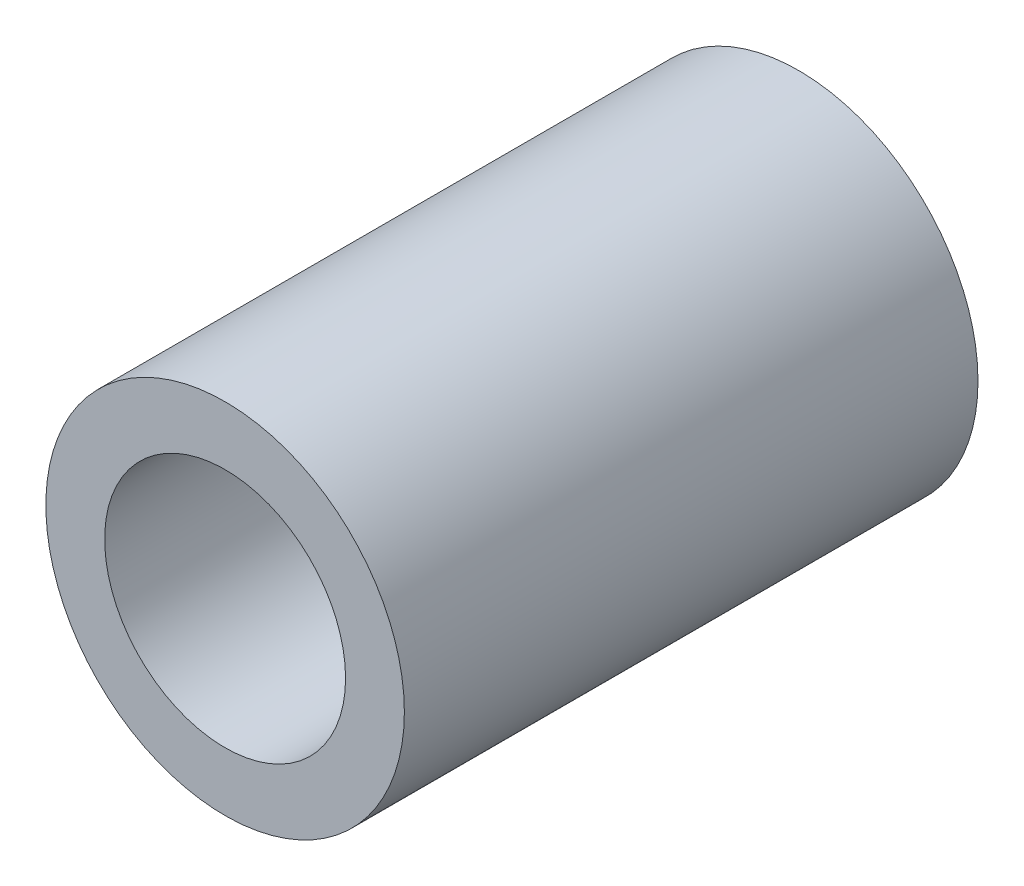
ISO-10303-21;
HEADER;
FILE_DESCRIPTION(('STEP AP214'),'2;1');
FILE_NAME('part.step','',(''),(''),'','','');
FILE_SCHEMA(('AUTOMOTIVE_DESIGN { 1 0 10303 214 1 1 1 1 }'));
ENDSEC;
DATA;
#1=APPLICATION_CONTEXT('core data for automotive mechanical design processes');
#2=APPLICATION_PROTOCOL_DEFINITION('international standard','automotive_design',2000,#1);
#3=PRODUCT_CONTEXT('',#1,'mechanical');
#4=PRODUCT('Part','Part','',(#3));
#5=PRODUCT_RELATED_PRODUCT_CATEGORY('part','',(#4));
#6=PRODUCT_DEFINITION_FORMATION('','',#4);
#7=PRODUCT_DEFINITION_CONTEXT('part definition',#1,'design');
#8=PRODUCT_DEFINITION('design','',#6,#7);
#9=PRODUCT_DEFINITION_SHAPE('','',#8);
#10=(LENGTH_UNIT() NAMED_UNIT(*) SI_UNIT(.MILLI.,.METRE.));
#11=(NAMED_UNIT(*) PLANE_ANGLE_UNIT() SI_UNIT($,.RADIAN.));
#12=(NAMED_UNIT(*) SI_UNIT($,.STERADIAN.) SOLID_ANGLE_UNIT());
#13=UNCERTAINTY_MEASURE_WITH_UNIT(LENGTH_MEASURE(1.E-05),#10,'distance_accuracy_value','');
#14=(GEOMETRIC_REPRESENTATION_CONTEXT(3) GLOBAL_UNCERTAINTY_ASSIGNED_CONTEXT((#13)) GLOBAL_UNIT_ASSIGNED_CONTEXT((#10,
#11,#12)) REPRESENTATION_CONTEXT('',''));
#15=CARTESIAN_POINT('',(0.,0.,0.));
#16=DIRECTION('',(0.,0.,1.));
#17=DIRECTION('',(1.,0.,0.));
#18=AXIS2_PLACEMENT_3D('',#15,#16,#17);
#19=CARTESIAN_POINT('',(0.,1022.35,-134.619999999996));
#20=DIRECTION('',(0.,0.,-1.));
#21=DIRECTION('',(-1.,0.,0.));
#22=AXIS2_PLACEMENT_3D('',#19,#20,#21);
#23=PLANE('',#22);
#24=CARTESIAN_POINT('',(0.,1006.475,-134.619999999996));
#25=DIRECTION('',(0.,0.,1.));
#26=DIRECTION('',(1.,0.,0.));
#27=AXIS2_PLACEMENT_3D('',#24,#25,#26);
#28=CIRCLE('',#27,10.6680000000001);
#29=CARTESIAN_POINT('',(10.6680000000001,1006.475,-134.619999999996));
#30=VERTEX_POINT('',#29);
#31=EDGE_CURVE('E10',#30,#30,#28,.T.);
#32=ORIENTED_EDGE('',*,*,#31,.F.);
#33=EDGE_LOOP('',(#32));
#34=FACE_BOUND('',#33,.T.);
#35=CARTESIAN_POINT('',(0.,1006.475,-134.619999999996));
#36=DIRECTION('',(0.,0.,1.));
#37=DIRECTION('',(1.,0.,0.));
#38=AXIS2_PLACEMENT_3D('',#35,#36,#37);
#39=CIRCLE('',#38,15.8750000000001);
#40=CARTESIAN_POINT('',(15.8750000000001,1006.475,-134.619999999996));
#41=VERTEX_POINT('',#40);
#42=EDGE_CURVE('E47',#41,#41,#39,.T.);
#43=ORIENTED_EDGE('',*,*,#42,.T.);
#44=EDGE_LOOP('',(#43));
#45=FACE_BOUND('',#44,.T.);
#46=ADVANCED_FACE('F33',(#34,#45),#23,.F.);
#47=CARTESIAN_POINT('',(0.,1006.475,3.3584246494911E-12));
#48=DIRECTION('',(0.,0.,1.));
#49=DIRECTION('',(1.,0.,0.));
#50=AXIS2_PLACEMENT_3D('',#47,#48,#49);
#51=CYLINDRICAL_SURFACE('',#50,10.668);
#52=CARTESIAN_POINT('',(0.,1006.475,-185.419999999996));
#53=DIRECTION('',(0.,0.,1.));
#54=DIRECTION('',(1.,0.,0.));
#55=AXIS2_PLACEMENT_3D('',#52,#53,#54);
#56=CIRCLE('',#55,10.6679999999999);
#57=CARTESIAN_POINT('',(10.6679999999999,1006.475,-185.419999999996));
#58=VERTEX_POINT('',#57);
#59=EDGE_CURVE('E39',#58,#58,#56,.T.);
#60=ORIENTED_EDGE('',*,*,#59,.F.);
#61=EDGE_LOOP('',(#60));
#62=FACE_BOUND('',#61,.T.);
#63=ORIENTED_EDGE('',*,*,#31,.T.);
#64=EDGE_LOOP('',(#63));
#65=FACE_BOUND('',#64,.T.);
#66=ADVANCED_FACE('F62',(#62,#65),#51,.F.);
#67=CARTESIAN_POINT('',(0.,1022.35,-185.419999999996));
#68=DIRECTION('',(0.,0.,1.));
#69=DIRECTION('',(1.,0.,0.));
#70=AXIS2_PLACEMENT_3D('',#67,#68,#69);
#71=PLANE('',#70);
#72=CARTESIAN_POINT('',(0.,1006.475,-185.419999999996));
#73=DIRECTION('',(0.,0.,1.));
#74=DIRECTION('',(1.,0.,0.));
#75=AXIS2_PLACEMENT_3D('',#72,#73,#74);
#76=CIRCLE('',#75,15.8750000000003);
#77=CARTESIAN_POINT('',(15.8750000000003,1006.475,-185.419999999996));
#78=VERTEX_POINT('',#77);
#79=EDGE_CURVE('E43',#78,#78,#76,.T.);
#80=ORIENTED_EDGE('',*,*,#79,.F.);
#81=EDGE_LOOP('',(#80));
#82=FACE_BOUND('',#81,.T.);
#83=ORIENTED_EDGE('',*,*,#59,.T.);
#84=EDGE_LOOP('',(#83));
#85=FACE_BOUND('',#84,.T.);
#86=ADVANCED_FACE('F57',(#82,#85),#71,.F.);
#87=CARTESIAN_POINT('',(0.,1006.475,3.3584246494911E-12));
#88=DIRECTION('',(0.,0.,1.));
#89=DIRECTION('',(1.,0.,0.));
#90=AXIS2_PLACEMENT_3D('',#87,#88,#89);
#91=CYLINDRICAL_SURFACE('',#90,15.8750000000002);
#92=ORIENTED_EDGE('',*,*,#42,.F.);
#93=EDGE_LOOP('',(#92));
#94=FACE_BOUND('',#93,.T.);
#95=ORIENTED_EDGE('',*,*,#79,.T.);
#96=EDGE_LOOP('',(#95));
#97=FACE_BOUND('',#96,.T.);
#98=ADVANCED_FACE('F54',(#94,#97),#91,.T.);
#99=CLOSED_SHELL('',(#46,#66,#86,#98));
#100=MANIFOLD_SOLID_BREP('B2',#99);
#101=ADVANCED_BREP_SHAPE_REPRESENTATION('',(#18,#100),#14);
#102=SHAPE_DEFINITION_REPRESENTATION(#9,#101);
ENDSEC;
END-ISO-10303-21;
